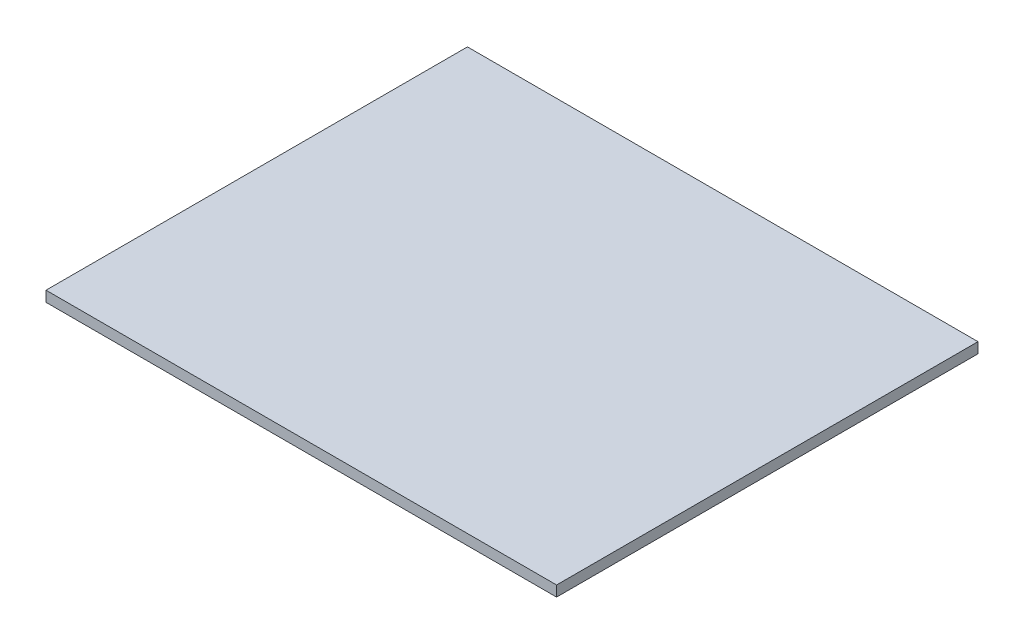
ISO-10303-21;
HEADER;
FILE_DESCRIPTION(('STEP AP214'),'2;1');
FILE_NAME('part.step','',(''),(''),'','','');
FILE_SCHEMA(('AUTOMOTIVE_DESIGN { 1 0 10303 214 1 1 1 1 }'));
ENDSEC;
DATA;
#1=APPLICATION_CONTEXT('core data for automotive mechanical design processes');
#2=APPLICATION_PROTOCOL_DEFINITION('international standard','automotive_design',2000,#1);
#3=PRODUCT_CONTEXT('',#1,'mechanical');
#4=PRODUCT('Part','Part','',(#3));
#5=PRODUCT_RELATED_PRODUCT_CATEGORY('part','',(#4));
#6=PRODUCT_DEFINITION_FORMATION('','',#4);
#7=PRODUCT_DEFINITION_CONTEXT('part definition',#1,'design');
#8=PRODUCT_DEFINITION('design','',#6,#7);
#9=PRODUCT_DEFINITION_SHAPE('','',#8);
#10=(LENGTH_UNIT() NAMED_UNIT(*) SI_UNIT(.MILLI.,.METRE.));
#11=(NAMED_UNIT(*) PLANE_ANGLE_UNIT() SI_UNIT($,.RADIAN.));
#12=(NAMED_UNIT(*) SI_UNIT($,.STERADIAN.) SOLID_ANGLE_UNIT());
#13=UNCERTAINTY_MEASURE_WITH_UNIT(LENGTH_MEASURE(1.E-05),#10,'distance_accuracy_value','');
#14=(GEOMETRIC_REPRESENTATION_CONTEXT(3) GLOBAL_UNCERTAINTY_ASSIGNED_CONTEXT((#13)) GLOBAL_UNIT_ASSIGNED_CONTEXT((#10,
#11,#12)) REPRESENTATION_CONTEXT('',''));
#15=CARTESIAN_POINT('',(0.,0.,0.));
#16=DIRECTION('',(0.,0.,1.));
#17=DIRECTION('',(1.,0.,0.));
#18=AXIS2_PLACEMENT_3D('',#15,#16,#17);
#19=CARTESIAN_POINT('',(-230.950008,119.05,381.25));
#20=DIRECTION('',(1.,0.,0.));
#21=DIRECTION('',(0.,1.,0.));
#22=AXIS2_PLACEMENT_3D('',#19,#20,#21);
#23=PLANE('',#22);
#24=DIRECTION('',(0.,-1.,0.));
#25=VECTOR('',#24,1.);
#26=CARTESIAN_POINT('',(-230.950008,119.05,0.));
#27=LINE('',#26,#25);
#28=CARTESIAN_POINT('',(-230.950008,119.05,0.));
#29=VERTEX_POINT('',#28);
#30=CARTESIAN_POINT('',(-230.950008,109.525,0.));
#31=VERTEX_POINT('',#30);
#32=EDGE_CURVE('E103',#29,#31,#27,.T.);
#33=ORIENTED_EDGE('',*,*,#32,.T.);
#34=DIRECTION('',(0.,0.,-1.));
#35=VECTOR('',#34,1.);
#36=CARTESIAN_POINT('',(-230.950008,109.525,381.25));
#37=LINE('',#36,#35);
#38=CARTESIAN_POINT('',(-230.950008,109.525,381.25));
#39=VERTEX_POINT('',#38);
#40=EDGE_CURVE('E11',#39,#31,#37,.T.);
#41=ORIENTED_EDGE('',*,*,#40,.F.);
#42=DIRECTION('',(0.,-1.,0.));
#43=VECTOR('',#42,1.);
#44=CARTESIAN_POINT('',(-230.950008,119.05,381.25));
#45=LINE('',#44,#43);
#46=CARTESIAN_POINT('',(-230.950008,119.05,381.25));
#47=VERTEX_POINT('',#46);
#48=EDGE_CURVE('E89',#47,#39,#45,.T.);
#49=ORIENTED_EDGE('',*,*,#48,.F.);
#50=DIRECTION('',(0.,0.,-1.));
#51=VECTOR('',#50,1.);
#52=CARTESIAN_POINT('',(-230.950008,119.05,381.25));
#53=LINE('',#52,#51);
#54=EDGE_CURVE('E56',#47,#29,#53,.T.);
#55=ORIENTED_EDGE('',*,*,#54,.T.);
#56=EDGE_LOOP('',(#33,#41,#49,#55));
#57=FACE_BOUND('',#56,.T.);
#58=ADVANCED_FACE('F40',(#57),#23,.F.);
#59=CARTESIAN_POINT('',(-230.950008,109.525,381.25));
#60=DIRECTION('',(0.,1.,0.));
#61=DIRECTION('',(0.,0.,1.));
#62=AXIS2_PLACEMENT_3D('',#59,#60,#61);
#63=PLANE('',#62);
#64=DIRECTION('',(1.,0.,0.));
#65=VECTOR('',#64,1.);
#66=CARTESIAN_POINT('',(-230.950008,109.525,0.));
#67=LINE('',#66,#65);
#68=CARTESIAN_POINT('',(230.950008,109.525,0.));
#69=VERTEX_POINT('',#68);
#70=EDGE_CURVE('E94',#31,#69,#67,.T.);
#71=ORIENTED_EDGE('',*,*,#70,.T.);
#72=DIRECTION('',(0.,0.,-1.));
#73=VECTOR('',#72,1.);
#74=CARTESIAN_POINT('',(230.950008,109.525,381.25));
#75=LINE('',#74,#73);
#76=CARTESIAN_POINT('',(230.950008,109.525,381.25));
#77=VERTEX_POINT('',#76);
#78=EDGE_CURVE('E48',#77,#69,#75,.T.);
#79=ORIENTED_EDGE('',*,*,#78,.F.);
#80=DIRECTION('',(1.,0.,0.));
#81=VECTOR('',#80,1.);
#82=CARTESIAN_POINT('',(-230.950008,109.525,381.25));
#83=LINE('',#82,#81);
#84=EDGE_CURVE('E81',#39,#77,#83,.T.);
#85=ORIENTED_EDGE('',*,*,#84,.F.);
#86=ORIENTED_EDGE('',*,*,#40,.T.);
#87=EDGE_LOOP('',(#71,#79,#85,#86));
#88=FACE_BOUND('',#87,.T.);
#89=ADVANCED_FACE('F93',(#88),#63,.F.);
#90=CARTESIAN_POINT('',(230.950008,119.05,381.25));
#91=DIRECTION('',(1.,0.,0.));
#92=DIRECTION('',(0.,1.,0.));
#93=AXIS2_PLACEMENT_3D('',#90,#91,#92);
#94=PLANE('',#93);
#95=DIRECTION('',(0.,-1.,0.));
#96=VECTOR('',#95,1.);
#97=CARTESIAN_POINT('',(230.950008,119.05,0.));
#98=LINE('',#97,#96);
#99=CARTESIAN_POINT('',(230.950008,119.05,0.));
#100=VERTEX_POINT('',#99);
#101=EDGE_CURVE('E106',#100,#69,#98,.T.);
#102=ORIENTED_EDGE('',*,*,#101,.F.);
#103=DIRECTION('',(0.,0.,-1.));
#104=VECTOR('',#103,1.);
#105=CARTESIAN_POINT('',(230.950008,119.05,381.25));
#106=LINE('',#105,#104);
#107=CARTESIAN_POINT('',(230.950008,119.05,381.25));
#108=VERTEX_POINT('',#107);
#109=EDGE_CURVE('E70',#108,#100,#106,.T.);
#110=ORIENTED_EDGE('',*,*,#109,.F.);
#111=DIRECTION('',(0.,-1.,0.));
#112=VECTOR('',#111,1.);
#113=CARTESIAN_POINT('',(230.950008,119.05,381.25));
#114=LINE('',#113,#112);
#115=EDGE_CURVE('E88',#108,#77,#114,.T.);
#116=ORIENTED_EDGE('',*,*,#115,.T.);
#117=ORIENTED_EDGE('',*,*,#78,.T.);
#118=EDGE_LOOP('',(#102,#110,#116,#117));
#119=FACE_BOUND('',#118,.T.);
#120=ADVANCED_FACE('F97',(#119),#94,.T.);
#121=CARTESIAN_POINT('',(-230.950008,119.05,381.25));
#122=DIRECTION('',(0.,1.,0.));
#123=DIRECTION('',(0.,0.,1.));
#124=AXIS2_PLACEMENT_3D('',#121,#122,#123);
#125=PLANE('',#124);
#126=DIRECTION('',(1.,0.,0.));
#127=VECTOR('',#126,1.);
#128=CARTESIAN_POINT('',(-230.950008,119.05,0.));
#129=LINE('',#128,#127);
#130=EDGE_CURVE('E108',#29,#100,#129,.T.);
#131=ORIENTED_EDGE('',*,*,#130,.F.);
#132=ORIENTED_EDGE('',*,*,#54,.F.);
#133=DIRECTION('',(1.,0.,0.));
#134=VECTOR('',#133,1.);
#135=CARTESIAN_POINT('',(-230.950008,119.05,381.25));
#136=LINE('',#135,#134);
#137=EDGE_CURVE('E98',#47,#108,#136,.T.);
#138=ORIENTED_EDGE('',*,*,#137,.T.);
#139=ORIENTED_EDGE('',*,*,#109,.T.);
#140=EDGE_LOOP('',(#131,#132,#138,#139));
#141=FACE_BOUND('',#140,.T.);
#142=ADVANCED_FACE('F114',(#141),#125,.T.);
#143=CARTESIAN_POINT('',(0.,0.,381.25));
#144=DIRECTION('',(0.,0.,1.));
#145=DIRECTION('',(1.,0.,0.));
#146=AXIS2_PLACEMENT_3D('',#143,#144,#145);
#147=PLANE('',#146);
#148=ORIENTED_EDGE('',*,*,#48,.T.);
#149=ORIENTED_EDGE('',*,*,#84,.T.);
#150=ORIENTED_EDGE('',*,*,#115,.F.);
#151=ORIENTED_EDGE('',*,*,#137,.F.);
#152=EDGE_LOOP('',(#148,#149,#150,#151));
#153=FACE_BOUND('',#152,.T.);
#154=ADVANCED_FACE('F85',(#153),#147,.T.);
#155=CARTESIAN_POINT('',(0.,0.,0.));
#156=DIRECTION('',(0.,0.,1.));
#157=DIRECTION('',(1.,0.,0.));
#158=AXIS2_PLACEMENT_3D('',#155,#156,#157);
#159=PLANE('',#158);
#160=ORIENTED_EDGE('',*,*,#32,.F.);
#161=ORIENTED_EDGE('',*,*,#130,.T.);
#162=ORIENTED_EDGE('',*,*,#101,.T.);
#163=ORIENTED_EDGE('',*,*,#70,.F.);
#164=EDGE_LOOP('',(#160,#161,#162,#163));
#165=FACE_BOUND('',#164,.T.);
#166=ADVANCED_FACE('F113',(#165),#159,.F.);
#167=CLOSED_SHELL('',(#58,#89,#120,#142,#154,#166));
#168=MANIFOLD_SOLID_BREP('B2',#167);
#169=ADVANCED_BREP_SHAPE_REPRESENTATION('',(#18,#168),#14);
#170=SHAPE_DEFINITION_REPRESENTATION(#9,#169);
ENDSEC;
END-ISO-10303-21;
